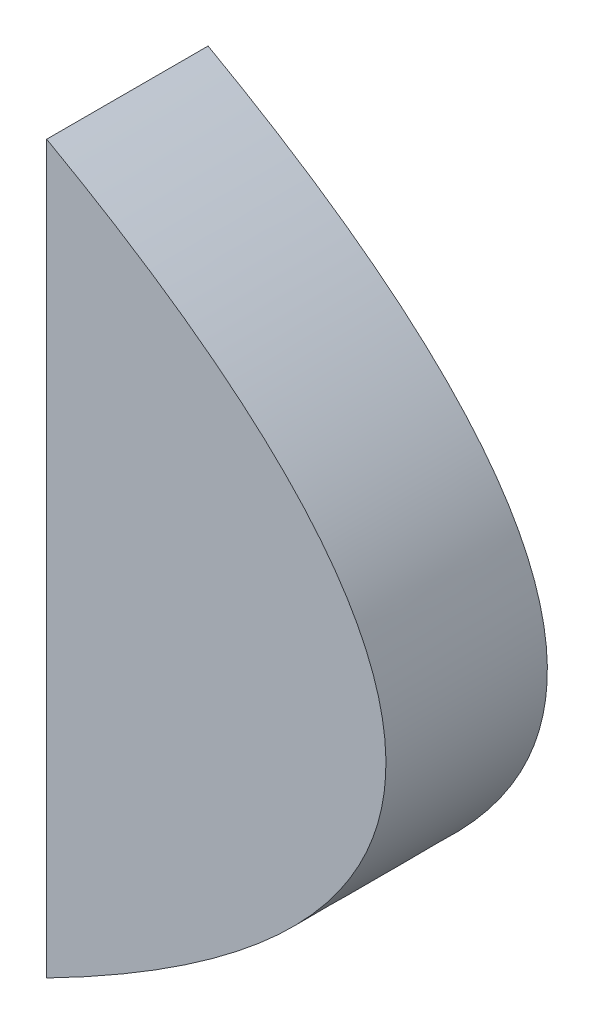
ISO-10303-21;
HEADER;
FILE_DESCRIPTION(('STEP AP214'),'2;1');
FILE_NAME('part.step','',(''),(''),'','','');
FILE_SCHEMA(('AUTOMOTIVE_DESIGN { 1 0 10303 214 1 1 1 1 }'));
ENDSEC;
DATA;
#1=APPLICATION_CONTEXT('core data for automotive mechanical design processes');
#2=APPLICATION_PROTOCOL_DEFINITION('international standard','automotive_design',2000,#1);
#3=PRODUCT_CONTEXT('',#1,'mechanical');
#4=PRODUCT('Part','Part','',(#3));
#5=PRODUCT_RELATED_PRODUCT_CATEGORY('part','',(#4));
#6=PRODUCT_DEFINITION_FORMATION('','',#4);
#7=PRODUCT_DEFINITION_CONTEXT('part definition',#1,'design');
#8=PRODUCT_DEFINITION('design','',#6,#7);
#9=PRODUCT_DEFINITION_SHAPE('','',#8);
#10=(LENGTH_UNIT() NAMED_UNIT(*) SI_UNIT(.MILLI.,.METRE.));
#11=(NAMED_UNIT(*) PLANE_ANGLE_UNIT() SI_UNIT($,.RADIAN.));
#12=(NAMED_UNIT(*) SI_UNIT($,.STERADIAN.) SOLID_ANGLE_UNIT());
#13=UNCERTAINTY_MEASURE_WITH_UNIT(LENGTH_MEASURE(1.E-05),#10,'distance_accuracy_value','');
#14=(GEOMETRIC_REPRESENTATION_CONTEXT(3) GLOBAL_UNCERTAINTY_ASSIGNED_CONTEXT((#13)) GLOBAL_UNIT_ASSIGNED_CONTEXT((#10,
#11,#12)) REPRESENTATION_CONTEXT('',''));
#15=CARTESIAN_POINT('',(0.,0.,0.));
#16=DIRECTION('',(0.,0.,1.));
#17=DIRECTION('',(1.,0.,0.));
#18=AXIS2_PLACEMENT_3D('',#15,#16,#17);
#19=CARTESIAN_POINT('',(0.,-45.,10.));
#20=CARTESIAN_POINT('',(42.0324604941794,-23.4481388930232,10.));
#21=CARTESIAN_POINT('',(0.,0.,10.));
#22=(BOUNDED_CURVE() B_SPLINE_CURVE(2,(#19,#20,#21),.UNSPECIFIED.,.F.,
.F.) B_SPLINE_CURVE_WITH_KNOTS((3,3),(0.,1.),
.UNSPECIFIED.) CURVE() GEOMETRIC_REPRESENTATION_ITEM() RATIONAL_B_SPLINE_CURVE((1.,1.,1.)) REPRESENTATION_ITEM(''));
#23=DIRECTION('',(0.,0.,-1.));
#24=VECTOR('',#23,1.);
#25=SURFACE_OF_LINEAR_EXTRUSION('',#22,#24);
#26=CARTESIAN_POINT('',(0.,-45.,0.));
#27=CARTESIAN_POINT('',(42.0324604941794,-23.4481388930232,0.));
#28=CARTESIAN_POINT('',(0.,0.,0.));
#29=(BOUNDED_CURVE() B_SPLINE_CURVE(2,(#26,#27,#28),.UNSPECIFIED.,.F.,
.F.) B_SPLINE_CURVE_WITH_KNOTS((3,3),(0.,1.),
.UNSPECIFIED.) CURVE() GEOMETRIC_REPRESENTATION_ITEM() RATIONAL_B_SPLINE_CURVE((1.,1.,1.)) REPRESENTATION_ITEM(''));
#30=CARTESIAN_POINT('',(0.,-45.,0.));
#31=VERTEX_POINT('',#30);
#32=CARTESIAN_POINT('',(0.,0.,0.));
#33=VERTEX_POINT('',#32);
#34=EDGE_CURVE('E65',#31,#33,#29,.T.);
#35=ORIENTED_EDGE('',*,*,#34,.T.);
#36=DIRECTION('',(0.,0.,-1.));
#37=VECTOR('',#36,1.);
#38=CARTESIAN_POINT('',(0.,0.,10.));
#39=LINE('',#38,#37);
#40=CARTESIAN_POINT('',(0.,0.,10.));
#41=VERTEX_POINT('',#40);
#42=EDGE_CURVE('E11',#41,#33,#39,.T.);
#43=ORIENTED_EDGE('',*,*,#42,.F.);
#44=CARTESIAN_POINT('',(0.,-45.,10.));
#45=VERTEX_POINT('',#44);
#46=EDGE_CURVE('E64',#45,#41,#22,.T.);
#47=ORIENTED_EDGE('',*,*,#46,.F.);
#48=DIRECTION('',(0.,0.,-1.));
#49=VECTOR('',#48,1.);
#50=CARTESIAN_POINT('',(0.,-45.,10.));
#51=LINE('',#50,#49);
#52=EDGE_CURVE('E42',#45,#31,#51,.T.);
#53=ORIENTED_EDGE('',*,*,#52,.T.);
#54=EDGE_LOOP('',(#35,#43,#47,#53));
#55=FACE_BOUND('',#54,.T.);
#56=ADVANCED_FACE('F33',(#55),#25,.F.);
#57=CARTESIAN_POINT('',(0.,0.,10.));
#58=DIRECTION('',(1.,0.,0.));
#59=DIRECTION('',(0.,1.,0.));
#60=AXIS2_PLACEMENT_3D('',#57,#58,#59);
#61=PLANE('',#60);
#62=DIRECTION('',(0.,-1.,0.));
#63=VECTOR('',#62,1.);
#64=CARTESIAN_POINT('',(0.,0.,0.));
#65=LINE('',#64,#63);
#66=EDGE_CURVE('E57',#33,#31,#65,.T.);
#67=ORIENTED_EDGE('',*,*,#66,.T.);
#68=ORIENTED_EDGE('',*,*,#52,.F.);
#69=DIRECTION('',(0.,-1.,0.));
#70=VECTOR('',#69,1.);
#71=CARTESIAN_POINT('',(0.,0.,10.));
#72=LINE('',#71,#70);
#73=EDGE_CURVE('E49',#41,#45,#72,.T.);
#74=ORIENTED_EDGE('',*,*,#73,.F.);
#75=ORIENTED_EDGE('',*,*,#42,.T.);
#76=EDGE_LOOP('',(#67,#68,#74,#75));
#77=FACE_BOUND('',#76,.T.);
#78=ADVANCED_FACE('F60',(#77),#61,.F.);
#79=CARTESIAN_POINT('',(21.0162302470897,-22.9740694465116,10.));
#80=DIRECTION('',(0.,0.,1.));
#81=DIRECTION('',(1.,0.,0.));
#82=AXIS2_PLACEMENT_3D('',#79,#80,#81);
#83=PLANE('',#82);
#84=ORIENTED_EDGE('',*,*,#46,.T.);
#85=ORIENTED_EDGE('',*,*,#73,.T.);
#86=EDGE_LOOP('',(#84,#85));
#87=FACE_BOUND('',#86,.T.);
#88=ADVANCED_FACE('F82',(#87),#83,.T.);
#89=CARTESIAN_POINT('',(21.0162302470897,-22.9740694465116,0.));
#90=DIRECTION('',(0.,0.,1.));
#91=DIRECTION('',(1.,0.,0.));
#92=AXIS2_PLACEMENT_3D('',#89,#90,#91);
#93=PLANE('',#92);
#94=ORIENTED_EDGE('',*,*,#34,.F.);
#95=ORIENTED_EDGE('',*,*,#66,.F.);
#96=EDGE_LOOP('',(#94,#95));
#97=FACE_BOUND('',#96,.T.);
#98=ADVANCED_FACE('F68',(#97),#93,.F.);
#99=CLOSED_SHELL('',(#56,#78,#88,#98));
#100=MANIFOLD_SOLID_BREP('B2',#99);
#101=ADVANCED_BREP_SHAPE_REPRESENTATION('',(#18,#100),#14);
#102=SHAPE_DEFINITION_REPRESENTATION(#9,#101);
ENDSEC;
END-ISO-10303-21;
